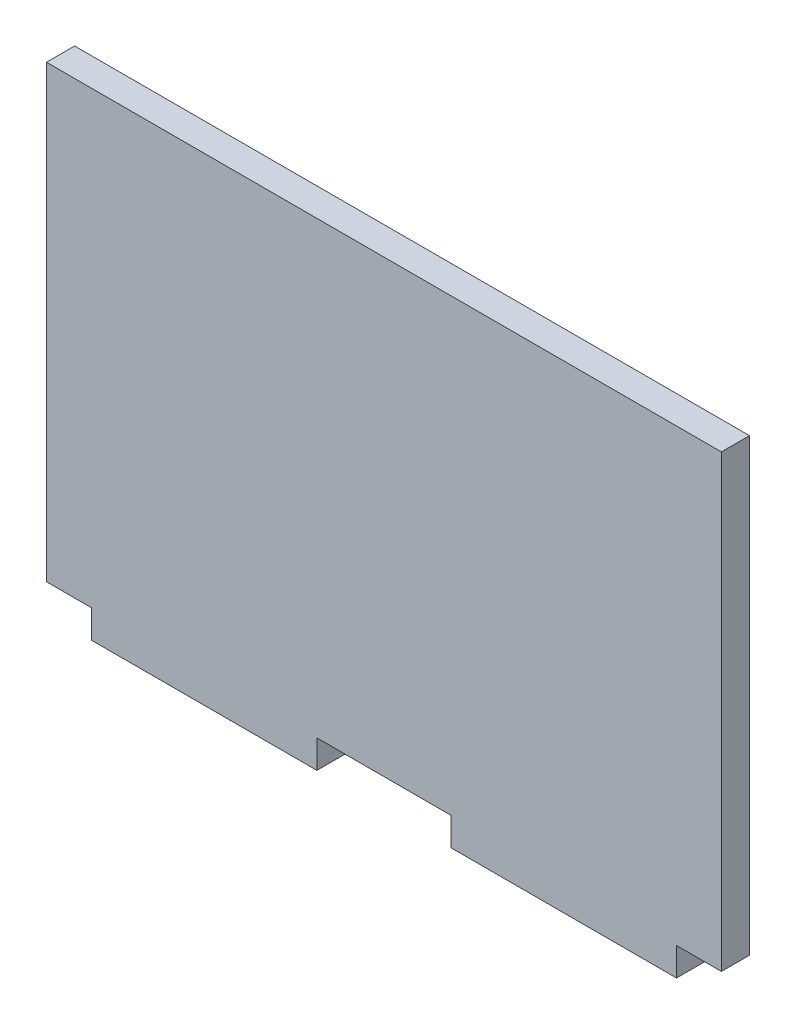
ISO-10303-21;
HEADER;
FILE_DESCRIPTION(('STEP AP214'),'2;1');
FILE_NAME('part.step','',(''),(''),'','','');
FILE_SCHEMA(('AUTOMOTIVE_DESIGN { 1 0 10303 214 1 1 1 1 }'));
ENDSEC;
DATA;
#1=APPLICATION_CONTEXT('core data for automotive mechanical design processes');
#2=APPLICATION_PROTOCOL_DEFINITION('international standard','automotive_design',2000,#1);
#3=PRODUCT_CONTEXT('',#1,'mechanical');
#4=PRODUCT('Part','Part','',(#3));
#5=PRODUCT_RELATED_PRODUCT_CATEGORY('part','',(#4));
#6=PRODUCT_DEFINITION_FORMATION('','',#4);
#7=PRODUCT_DEFINITION_CONTEXT('part definition',#1,'design');
#8=PRODUCT_DEFINITION('design','',#6,#7);
#9=PRODUCT_DEFINITION_SHAPE('','',#8);
#10=(LENGTH_UNIT() NAMED_UNIT(*) SI_UNIT(.MILLI.,.METRE.));
#11=(NAMED_UNIT(*) PLANE_ANGLE_UNIT() SI_UNIT($,.RADIAN.));
#12=(NAMED_UNIT(*) SI_UNIT($,.STERADIAN.) SOLID_ANGLE_UNIT());
#13=UNCERTAINTY_MEASURE_WITH_UNIT(LENGTH_MEASURE(1.E-05),#10,'distance_accuracy_value','');
#14=(GEOMETRIC_REPRESENTATION_CONTEXT(3) GLOBAL_UNCERTAINTY_ASSIGNED_CONTEXT((#13)) GLOBAL_UNIT_ASSIGNED_CONTEXT((#10,
#11,#12)) REPRESENTATION_CONTEXT('',''));
#15=CARTESIAN_POINT('',(0.,0.,0.));
#16=DIRECTION('',(0.,0.,1.));
#17=DIRECTION('',(1.,0.,0.));
#18=AXIS2_PLACEMENT_3D('',#15,#16,#17);
#19=CARTESIAN_POINT('',(0.,-25.401893638171,6.35));
#20=DIRECTION('',(0.,1.,0.));
#21=DIRECTION('',(0.,0.,1.));
#22=AXIS2_PLACEMENT_3D('',#19,#20,#21);
#23=PLANE('',#22);
#24=DIRECTION('',(1.,0.,0.));
#25=VECTOR('',#24,1.);
#26=CARTESIAN_POINT('',(0.,-25.401893638171,0.));
#27=LINE('',#26,#25);
#28=CARTESIAN_POINT('',(-17.7315769667708,-25.401893638171,0.));
#29=VERTEX_POINT('',#28);
#30=CARTESIAN_POINT('',(12.5449020164734,-25.401893638171,0.));
#31=VERTEX_POINT('',#30);
#32=EDGE_CURVE('E157',#29,#31,#27,.T.);
#33=ORIENTED_EDGE('',*,*,#32,.T.);
#34=DIRECTION('',(0.,0.,-1.));
#35=VECTOR('',#34,1.);
#36=CARTESIAN_POINT('',(12.5449020164734,-25.401893638171,6.35));
#37=LINE('',#36,#35);
#38=CARTESIAN_POINT('',(12.5449020164734,-25.401893638171,6.35));
#39=VERTEX_POINT('',#38);
#40=EDGE_CURVE('E11',#39,#31,#37,.T.);
#41=ORIENTED_EDGE('',*,*,#40,.F.);
#42=DIRECTION('',(1.,0.,0.));
#43=VECTOR('',#42,1.);
#44=CARTESIAN_POINT('',(0.,-25.401893638171,6.35));
#45=LINE('',#44,#43);
#46=CARTESIAN_POINT('',(-17.7315769667708,-25.401893638171,6.35));
#47=VERTEX_POINT('',#46);
#48=EDGE_CURVE('E186',#47,#39,#45,.T.);
#49=ORIENTED_EDGE('',*,*,#48,.F.);
#50=DIRECTION('',(0.,0.,-1.));
#51=VECTOR('',#50,1.);
#52=CARTESIAN_POINT('',(-17.7315769667708,-25.401893638171,6.35));
#53=LINE('',#52,#51);
#54=EDGE_CURVE('E52',#47,#29,#53,.T.);
#55=ORIENTED_EDGE('',*,*,#54,.T.);
#56=EDGE_LOOP('',(#33,#41,#49,#55));
#57=FACE_BOUND('',#56,.T.);
#58=ADVANCED_FACE('F35',(#57),#23,.F.);
#59=CARTESIAN_POINT('',(12.5449020164732,0.,6.35));
#60=DIRECTION('',(1.,0.,0.));
#61=DIRECTION('',(0.,1.,0.));
#62=AXIS2_PLACEMENT_3D('',#59,#60,#61);
#63=PLANE('',#62);
#64=DIRECTION('',(0.,-1.,0.));
#65=VECTOR('',#64,1.);
#66=CARTESIAN_POINT('',(12.5449020164732,0.,0.));
#67=LINE('',#66,#65);
#68=CARTESIAN_POINT('',(12.5449020164734,-31.7518936381708,0.));
#69=VERTEX_POINT('',#68);
#70=EDGE_CURVE('E159',#31,#69,#67,.T.);
#71=ORIENTED_EDGE('',*,*,#70,.T.);
#72=DIRECTION('',(0.,0.,-1.));
#73=VECTOR('',#72,1.);
#74=CARTESIAN_POINT('',(12.5449020164734,-31.7518936381708,6.35));
#75=LINE('',#74,#73);
#76=CARTESIAN_POINT('',(12.5449020164734,-31.7518936381708,6.35));
#77=VERTEX_POINT('',#76);
#78=EDGE_CURVE('E44',#77,#69,#75,.T.);
#79=ORIENTED_EDGE('',*,*,#78,.F.);
#80=DIRECTION('',(0.,-1.,0.));
#81=VECTOR('',#80,1.);
#82=CARTESIAN_POINT('',(12.5449020164732,0.,6.35));
#83=LINE('',#82,#81);
#84=EDGE_CURVE('E103',#39,#77,#83,.T.);
#85=ORIENTED_EDGE('',*,*,#84,.F.);
#86=ORIENTED_EDGE('',*,*,#40,.T.);
#87=EDGE_LOOP('',(#71,#79,#85,#86));
#88=FACE_BOUND('',#87,.T.);
#89=ADVANCED_FACE('F37',(#88),#63,.F.);
#90=CARTESIAN_POINT('',(2.24966244463518E-13,-31.7518936381709,6.35));
#91=DIRECTION('',(0.,-1.,0.));
#92=DIRECTION('',(1.,0.,0.));
#93=AXIS2_PLACEMENT_3D('',#90,#91,#92);
#94=PLANE('',#93);
#95=DIRECTION('',(-1.,0.,0.));
#96=VECTOR('',#95,1.);
#97=CARTESIAN_POINT('',(2.24966244463518E-13,-31.7518936381709,0.));
#98=LINE('',#97,#96);
#99=CARTESIAN_POINT('',(63.4716405140593,-31.7518936381705,0.));
#100=VERTEX_POINT('',#99);
#101=EDGE_CURVE('E163',#100,#69,#98,.T.);
#102=ORIENTED_EDGE('',*,*,#101,.F.);
#103=DIRECTION('',(0.,0.,-1.));
#104=VECTOR('',#103,1.);
#105=CARTESIAN_POINT('',(63.4716405140593,-31.7518936381705,6.35));
#106=LINE('',#105,#104);
#107=CARTESIAN_POINT('',(63.4716405140593,-31.7518936381705,6.35));
#108=VERTEX_POINT('',#107);
#109=EDGE_CURVE('E201',#108,#100,#106,.T.);
#110=ORIENTED_EDGE('',*,*,#109,.F.);
#111=DIRECTION('',(-1.,0.,0.));
#112=VECTOR('',#111,1.);
#113=CARTESIAN_POINT('',(2.24966244463518E-13,-31.7518936381709,6.35));
#114=LINE('',#113,#112);
#115=EDGE_CURVE('E207',#108,#77,#114,.T.);
#116=ORIENTED_EDGE('',*,*,#115,.T.);
#117=ORIENTED_EDGE('',*,*,#78,.T.);
#118=EDGE_LOOP('',(#102,#110,#116,#117));
#119=FACE_BOUND('',#118,.T.);
#120=ADVANCED_FACE('F205',(#119),#94,.T.);
#121=CARTESIAN_POINT('',(63.4716405140592,2.77431798068659E-13,6.35));
#122=DIRECTION('',(1.,0.,0.));
#123=DIRECTION('',(0.,1.,0.));
#124=AXIS2_PLACEMENT_3D('',#121,#122,#123);
#125=PLANE('',#124);
#126=DIRECTION('',(0.,-1.,0.));
#127=VECTOR('',#126,1.);
#128=CARTESIAN_POINT('',(63.4716405140592,2.77431798068659E-13,0.));
#129=LINE('',#128,#127);
#130=CARTESIAN_POINT('',(63.4716405140593,-25.401893638171,0.));
#131=VERTEX_POINT('',#130);
#132=EDGE_CURVE('E166',#131,#100,#129,.T.);
#133=ORIENTED_EDGE('',*,*,#132,.F.);
#134=DIRECTION('',(0.,0.,-1.));
#135=VECTOR('',#134,1.);
#136=CARTESIAN_POINT('',(63.4716405140593,-25.401893638171,6.35));
#137=LINE('',#136,#135);
#138=CARTESIAN_POINT('',(63.4716405140593,-25.401893638171,6.35));
#139=VERTEX_POINT('',#138);
#140=EDGE_CURVE('E199',#139,#131,#137,.T.);
#141=ORIENTED_EDGE('',*,*,#140,.F.);
#142=DIRECTION('',(0.,-1.,0.));
#143=VECTOR('',#142,1.);
#144=CARTESIAN_POINT('',(63.4716405140592,2.77431798068659E-13,6.35));
#145=LINE('',#144,#143);
#146=EDGE_CURVE('E218',#139,#108,#145,.T.);
#147=ORIENTED_EDGE('',*,*,#146,.T.);
#148=ORIENTED_EDGE('',*,*,#109,.T.);
#149=EDGE_LOOP('',(#133,#141,#147,#148));
#150=FACE_BOUND('',#149,.T.);
#151=ADVANCED_FACE('F214',(#150),#125,.T.);
#152=CARTESIAN_POINT('',(0.,-25.401893638171,6.35));
#153=DIRECTION('',(0.,1.,0.));
#154=DIRECTION('',(0.,0.,1.));
#155=AXIS2_PLACEMENT_3D('',#152,#153,#154);
#156=PLANE('',#155);
#157=DIRECTION('',(1.,0.,0.));
#158=VECTOR('',#157,1.);
#159=CARTESIAN_POINT('',(0.,-25.401893638171,0.));
#160=LINE('',#159,#158);
#161=CARTESIAN_POINT('',(73.6066625248509,-25.401893638171,0.));
#162=VERTEX_POINT('',#161);
#163=EDGE_CURVE('E169',#131,#162,#160,.T.);
#164=ORIENTED_EDGE('',*,*,#163,.T.);
#165=DIRECTION('',(0.,0.,-1.));
#166=VECTOR('',#165,1.);
#167=CARTESIAN_POINT('',(73.6066625248509,-25.401893638171,6.35));
#168=LINE('',#167,#166);
#169=CARTESIAN_POINT('',(73.6066625248509,-25.401893638171,6.35));
#170=VERTEX_POINT('',#169);
#171=EDGE_CURVE('E197',#170,#162,#168,.T.);
#172=ORIENTED_EDGE('',*,*,#171,.F.);
#173=DIRECTION('',(1.,0.,0.));
#174=VECTOR('',#173,1.);
#175=CARTESIAN_POINT('',(0.,-25.401893638171,6.35));
#176=LINE('',#175,#174);
#177=EDGE_CURVE('E220',#139,#170,#176,.T.);
#178=ORIENTED_EDGE('',*,*,#177,.F.);
#179=ORIENTED_EDGE('',*,*,#140,.T.);
#180=EDGE_LOOP('',(#164,#172,#178,#179));
#181=FACE_BOUND('',#180,.T.);
#182=ADVANCED_FACE('F272',(#181),#156,.F.);
#183=CARTESIAN_POINT('',(73.6066625248509,0.,6.35));
#184=DIRECTION('',(1.,0.,0.));
#185=DIRECTION('',(0.,1.,0.));
#186=AXIS2_PLACEMENT_3D('',#183,#184,#185);
#187=PLANE('',#186);
#188=DIRECTION('',(0.,-1.,0.));
#189=VECTOR('',#188,1.);
#190=CARTESIAN_POINT('',(73.6066625248509,0.,0.));
#191=LINE('',#190,#189);
#192=CARTESIAN_POINT('',(73.6066625248509,76.198106361829,0.));
#193=VERTEX_POINT('',#192);
#194=EDGE_CURVE('E172',#193,#162,#191,.T.);
#195=ORIENTED_EDGE('',*,*,#194,.F.);
#196=DIRECTION('',(0.,0.,-1.));
#197=VECTOR('',#196,1.);
#198=CARTESIAN_POINT('',(73.6066625248509,76.198106361829,6.35));
#199=LINE('',#198,#197);
#200=CARTESIAN_POINT('',(73.6066625248509,76.198106361829,6.35));
#201=VERTEX_POINT('',#200);
#202=EDGE_CURVE('E195',#201,#193,#199,.T.);
#203=ORIENTED_EDGE('',*,*,#202,.F.);
#204=DIRECTION('',(0.,-1.,0.));
#205=VECTOR('',#204,1.);
#206=CARTESIAN_POINT('',(73.6066625248509,0.,6.35));
#207=LINE('',#206,#205);
#208=EDGE_CURVE('E226',#201,#170,#207,.T.);
#209=ORIENTED_EDGE('',*,*,#208,.T.);
#210=ORIENTED_EDGE('',*,*,#171,.T.);
#211=EDGE_LOOP('',(#195,#203,#209,#210));
#212=FACE_BOUND('',#211,.T.);
#213=ADVANCED_FACE('F269',(#212),#187,.T.);
#214=CARTESIAN_POINT('',(0.,76.198106361829,6.35));
#215=DIRECTION('',(0.,1.,0.));
#216=DIRECTION('',(0.,0.,1.));
#217=AXIS2_PLACEMENT_3D('',#214,#215,#216);
#218=PLANE('',#217);
#219=DIRECTION('',(1.,0.,0.));
#220=VECTOR('',#219,1.);
#221=CARTESIAN_POINT('',(0.,76.198106361829,0.));
#222=LINE('',#221,#220);
#223=CARTESIAN_POINT('',(-78.7933374751491,76.198106361829,0.));
#224=VERTEX_POINT('',#223);
#225=EDGE_CURVE('E175',#224,#193,#222,.T.);
#226=ORIENTED_EDGE('',*,*,#225,.F.);
#227=DIRECTION('',(0.,0.,-1.));
#228=VECTOR('',#227,1.);
#229=CARTESIAN_POINT('',(-78.7933374751491,76.198106361829,6.35));
#230=LINE('',#229,#228);
#231=CARTESIAN_POINT('',(-78.7933374751491,76.198106361829,6.35));
#232=VERTEX_POINT('',#231);
#233=EDGE_CURVE('E193',#232,#224,#230,.T.);
#234=ORIENTED_EDGE('',*,*,#233,.F.);
#235=DIRECTION('',(1.,0.,0.));
#236=VECTOR('',#235,1.);
#237=CARTESIAN_POINT('',(0.,76.198106361829,6.35));
#238=LINE('',#237,#236);
#239=EDGE_CURVE('E229',#232,#201,#238,.T.);
#240=ORIENTED_EDGE('',*,*,#239,.T.);
#241=ORIENTED_EDGE('',*,*,#202,.T.);
#242=EDGE_LOOP('',(#226,#234,#240,#241));
#243=FACE_BOUND('',#242,.T.);
#244=ADVANCED_FACE('F260',(#243),#218,.T.);
#245=CARTESIAN_POINT('',(-78.7933374751491,0.,6.35));
#246=DIRECTION('',(1.,0.,0.));
#247=DIRECTION('',(0.,1.,0.));
#248=AXIS2_PLACEMENT_3D('',#245,#246,#247);
#249=PLANE('',#248);
#250=DIRECTION('',(0.,-1.,0.));
#251=VECTOR('',#250,1.);
#252=CARTESIAN_POINT('',(-78.7933374751491,0.,0.));
#253=LINE('',#252,#251);
#254=CARTESIAN_POINT('',(-78.7933374751491,-25.401893638171,0.));
#255=VERTEX_POINT('',#254);
#256=EDGE_CURVE('E178',#224,#255,#253,.T.);
#257=ORIENTED_EDGE('',*,*,#256,.T.);
#258=DIRECTION('',(0.,0.,-1.));
#259=VECTOR('',#258,1.);
#260=CARTESIAN_POINT('',(-78.7933374751491,-25.401893638171,6.35));
#261=LINE('',#260,#259);
#262=CARTESIAN_POINT('',(-78.7933374751491,-25.401893638171,6.35));
#263=VERTEX_POINT('',#262);
#264=EDGE_CURVE('E190',#263,#255,#261,.T.);
#265=ORIENTED_EDGE('',*,*,#264,.F.);
#266=DIRECTION('',(0.,-1.,0.));
#267=VECTOR('',#266,1.);
#268=CARTESIAN_POINT('',(-78.7933374751491,0.,6.35));
#269=LINE('',#268,#267);
#270=EDGE_CURVE('E231',#232,#263,#269,.T.);
#271=ORIENTED_EDGE('',*,*,#270,.F.);
#272=ORIENTED_EDGE('',*,*,#233,.T.);
#273=EDGE_LOOP('',(#257,#265,#271,#272));
#274=FACE_BOUND('',#273,.T.);
#275=ADVANCED_FACE('F254',(#274),#249,.F.);
#276=CARTESIAN_POINT('',(-68.6583154643567,-25.401893638171,0.));
#277=VERTEX_POINT('',#276);
#278=EDGE_CURVE('E160',#255,#277,#27,.T.);
#279=ORIENTED_EDGE('',*,*,#278,.T.);
#280=DIRECTION('',(0.,0.,-1.));
#281=VECTOR('',#280,1.);
#282=CARTESIAN_POINT('',(-68.6583154643567,-25.401893638171,6.35));
#283=LINE('',#282,#281);
#284=CARTESIAN_POINT('',(-68.6583154643567,-25.401893638171,6.35));
#285=VERTEX_POINT('',#284);
#286=EDGE_CURVE('E149',#285,#277,#283,.T.);
#287=ORIENTED_EDGE('',*,*,#286,.F.);
#288=EDGE_CURVE('E137',#263,#285,#45,.T.);
#289=ORIENTED_EDGE('',*,*,#288,.F.);
#290=ORIENTED_EDGE('',*,*,#264,.T.);
#291=EDGE_LOOP('',(#279,#287,#289,#290));
#292=FACE_BOUND('',#291,.T.);
#293=ADVANCED_FACE('F247',(#292),#23,.F.);
#294=CARTESIAN_POINT('',(-68.6583154643567,0.,6.35));
#295=DIRECTION('',(1.,0.,0.));
#296=DIRECTION('',(0.,0.,-1.));
#297=AXIS2_PLACEMENT_3D('',#294,#295,#296);
#298=PLANE('',#297);
#299=DIRECTION('',(0.,-1.,0.));
#300=VECTOR('',#299,1.);
#301=CARTESIAN_POINT('',(-68.6583154643567,0.,0.));
#302=LINE('',#301,#300);
#303=CARTESIAN_POINT('',(-68.6583154643567,-31.751893638171,0.));
#304=VERTEX_POINT('',#303);
#305=EDGE_CURVE('E146',#277,#304,#302,.T.);
#306=ORIENTED_EDGE('',*,*,#305,.T.);
#307=DIRECTION('',(0.,0.,-1.));
#308=VECTOR('',#307,1.);
#309=CARTESIAN_POINT('',(-68.6583154643567,-31.751893638171,6.35));
#310=LINE('',#309,#308);
#311=CARTESIAN_POINT('',(-68.6583154643567,-31.751893638171,6.35));
#312=VERTEX_POINT('',#311);
#313=EDGE_CURVE('E143',#312,#304,#310,.T.);
#314=ORIENTED_EDGE('',*,*,#313,.F.);
#315=DIRECTION('',(0.,-1.,0.));
#316=VECTOR('',#315,1.);
#317=CARTESIAN_POINT('',(-68.6583154643567,0.,6.35));
#318=LINE('',#317,#316);
#319=EDGE_CURVE('E130',#285,#312,#318,.T.);
#320=ORIENTED_EDGE('',*,*,#319,.F.);
#321=ORIENTED_EDGE('',*,*,#286,.T.);
#322=EDGE_LOOP('',(#306,#314,#320,#321));
#323=FACE_BOUND('',#322,.T.);
#324=ADVANCED_FACE('F144',(#323),#298,.F.);
#325=CARTESIAN_POINT('',(0.,-31.751893638171,6.35));
#326=DIRECTION('',(0.,1.,0.));
#327=DIRECTION('',(0.,0.,1.));
#328=AXIS2_PLACEMENT_3D('',#325,#326,#327);
#329=PLANE('',#328);
#330=DIRECTION('',(1.,0.,0.));
#331=VECTOR('',#330,1.);
#332=CARTESIAN_POINT('',(0.,-31.751893638171,0.));
#333=LINE('',#332,#331);
#334=CARTESIAN_POINT('',(-17.7315769667708,-31.751893638171,0.));
#335=VERTEX_POINT('',#334);
#336=EDGE_CURVE('E181',#304,#335,#333,.T.);
#337=ORIENTED_EDGE('',*,*,#336,.T.);
#338=DIRECTION('',(0.,0.,-1.));
#339=VECTOR('',#338,1.);
#340=CARTESIAN_POINT('',(-17.7315769667708,-31.751893638171,6.35));
#341=LINE('',#340,#339);
#342=CARTESIAN_POINT('',(-17.7315769667708,-31.751893638171,6.35));
#343=VERTEX_POINT('',#342);
#344=EDGE_CURVE('E91',#343,#335,#341,.T.);
#345=ORIENTED_EDGE('',*,*,#344,.F.);
#346=DIRECTION('',(1.,0.,0.));
#347=VECTOR('',#346,1.);
#348=CARTESIAN_POINT('',(0.,-31.751893638171,6.35));
#349=LINE('',#348,#347);
#350=EDGE_CURVE('E135',#312,#343,#349,.T.);
#351=ORIENTED_EDGE('',*,*,#350,.F.);
#352=ORIENTED_EDGE('',*,*,#313,.T.);
#353=EDGE_LOOP('',(#337,#345,#351,#352));
#354=FACE_BOUND('',#353,.T.);
#355=ADVANCED_FACE('F151',(#354),#329,.F.);
#356=CARTESIAN_POINT('',(-17.7315769667708,0.,6.35));
#357=DIRECTION('',(1.,0.,0.));
#358=DIRECTION('',(0.,0.,-1.));
#359=AXIS2_PLACEMENT_3D('',#356,#357,#358);
#360=PLANE('',#359);
#361=DIRECTION('',(0.,-1.,0.));
#362=VECTOR('',#361,1.);
#363=CARTESIAN_POINT('',(-17.7315769667708,0.,0.));
#364=LINE('',#363,#362);
#365=EDGE_CURVE('E183',#29,#335,#364,.T.);
#366=ORIENTED_EDGE('',*,*,#365,.F.);
#367=ORIENTED_EDGE('',*,*,#54,.F.);
#368=DIRECTION('',(0.,-1.,0.));
#369=VECTOR('',#368,1.);
#370=CARTESIAN_POINT('',(-17.7315769667708,0.,6.35));
#371=LINE('',#370,#369);
#372=EDGE_CURVE('E152',#47,#343,#371,.T.);
#373=ORIENTED_EDGE('',*,*,#372,.T.);
#374=ORIENTED_EDGE('',*,*,#344,.T.);
#375=EDGE_LOOP('',(#366,#367,#373,#374));
#376=FACE_BOUND('',#375,.T.);
#377=ADVANCED_FACE('F235',(#376),#360,.T.);
#378=CARTESIAN_POINT('',(0.,0.,6.35));
#379=DIRECTION('',(0.,0.,1.));
#380=DIRECTION('',(1.,0.,0.));
#381=AXIS2_PLACEMENT_3D('',#378,#379,#380);
#382=PLANE('',#381);
#383=ORIENTED_EDGE('',*,*,#48,.T.);
#384=ORIENTED_EDGE('',*,*,#84,.T.);
#385=ORIENTED_EDGE('',*,*,#115,.F.);
#386=ORIENTED_EDGE('',*,*,#146,.F.);
#387=ORIENTED_EDGE('',*,*,#177,.T.);
#388=ORIENTED_EDGE('',*,*,#208,.F.);
#389=ORIENTED_EDGE('',*,*,#239,.F.);
#390=ORIENTED_EDGE('',*,*,#270,.T.);
#391=ORIENTED_EDGE('',*,*,#288,.T.);
#392=ORIENTED_EDGE('',*,*,#319,.T.);
#393=ORIENTED_EDGE('',*,*,#350,.T.);
#394=ORIENTED_EDGE('',*,*,#372,.F.);
#395=EDGE_LOOP('',(#383,#384,#385,#386,#387,#388,#389,#390,#391,#392,#393,#394));
#396=FACE_BOUND('',#395,.T.);
#397=ADVANCED_FACE('F132',(#396),#382,.T.);
#398=CARTESIAN_POINT('',(0.,0.,0.));
#399=DIRECTION('',(0.,0.,1.));
#400=DIRECTION('',(1.,0.,0.));
#401=AXIS2_PLACEMENT_3D('',#398,#399,#400);
#402=PLANE('',#401);
#403=ORIENTED_EDGE('',*,*,#32,.F.);
#404=ORIENTED_EDGE('',*,*,#365,.T.);
#405=ORIENTED_EDGE('',*,*,#336,.F.);
#406=ORIENTED_EDGE('',*,*,#305,.F.);
#407=ORIENTED_EDGE('',*,*,#278,.F.);
#408=ORIENTED_EDGE('',*,*,#256,.F.);
#409=ORIENTED_EDGE('',*,*,#225,.T.);
#410=ORIENTED_EDGE('',*,*,#194,.T.);
#411=ORIENTED_EDGE('',*,*,#163,.F.);
#412=ORIENTED_EDGE('',*,*,#132,.T.);
#413=ORIENTED_EDGE('',*,*,#101,.T.);
#414=ORIENTED_EDGE('',*,*,#70,.F.);
#415=EDGE_LOOP('',(#403,#404,#405,#406,#407,#408,#409,#410,#411,#412,#413,#414));
#416=FACE_BOUND('',#415,.T.);
#417=ADVANCED_FACE('F210',(#416),#402,.F.);
#418=CLOSED_SHELL('',(#58,#89,#120,#151,#182,#213,#244,#275,#293,#324,#355,#377,#397,#417));
#419=MANIFOLD_SOLID_BREP('B2',#418);
#420=ADVANCED_BREP_SHAPE_REPRESENTATION('',(#18,#419),#14);
#421=SHAPE_DEFINITION_REPRESENTATION(#9,#420);
ENDSEC;
END-ISO-10303-21;
